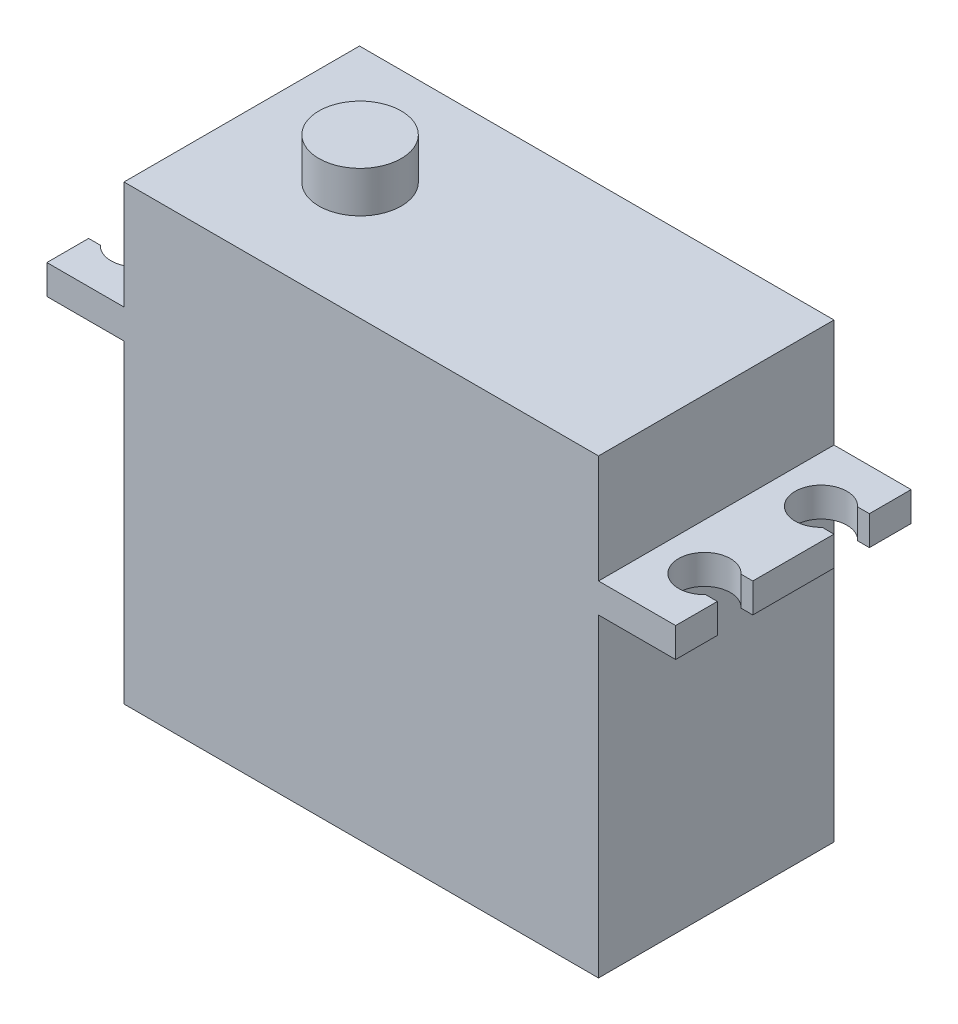
ISO-10303-21;
HEADER;
FILE_DESCRIPTION(('STEP AP214'),'2;1');
FILE_NAME('part.step','',(''),(''),'','','');
FILE_SCHEMA(('AUTOMOTIVE_DESIGN { 1 0 10303 214 1 1 1 1 }'));
ENDSEC;
DATA;
#1=APPLICATION_CONTEXT('core data for automotive mechanical design processes');
#2=APPLICATION_PROTOCOL_DEFINITION('international standard','automotive_design',2000,#1);
#3=PRODUCT_CONTEXT('',#1,'mechanical');
#4=PRODUCT('Part','Part','',(#3));
#5=PRODUCT_RELATED_PRODUCT_CATEGORY('part','',(#4));
#6=PRODUCT_DEFINITION_FORMATION('','',#4);
#7=PRODUCT_DEFINITION_CONTEXT('part definition',#1,'design');
#8=PRODUCT_DEFINITION('design','',#6,#7);
#9=PRODUCT_DEFINITION_SHAPE('','',#8);
#10=(LENGTH_UNIT() NAMED_UNIT(*) SI_UNIT(.MILLI.,.METRE.));
#11=(NAMED_UNIT(*) PLANE_ANGLE_UNIT() SI_UNIT($,.RADIAN.));
#12=(NAMED_UNIT(*) SI_UNIT($,.STERADIAN.) SOLID_ANGLE_UNIT());
#13=UNCERTAINTY_MEASURE_WITH_UNIT(LENGTH_MEASURE(1.E-05),#10,'distance_accuracy_value','');
#14=(GEOMETRIC_REPRESENTATION_CONTEXT(3) GLOBAL_UNCERTAINTY_ASSIGNED_CONTEXT((#13)) GLOBAL_UNIT_ASSIGNED_CONTEXT((#10,
#11,#12)) REPRESENTATION_CONTEXT('',''));
#15=CARTESIAN_POINT('',(0.,0.,0.));
#16=DIRECTION('',(0.,0.,1.));
#17=DIRECTION('',(1.,0.,0.));
#18=AXIS2_PLACEMENT_3D('',#15,#16,#17);
#19=CARTESIAN_POINT('',(20.15,38.4,-10.));
#20=DIRECTION('',(-1.,0.,0.));
#21=DIRECTION('',(0.,0.,1.));
#22=AXIS2_PLACEMENT_3D('',#19,#20,#21);
#23=PLANE('',#22);
#24=DIRECTION('',(0.,0.,1.));
#25=VECTOR('',#24,1.);
#26=CARTESIAN_POINT('',(20.15,29.2,-10.));
#27=LINE('',#26,#25);
#28=CARTESIAN_POINT('',(20.150000000001,29.2,-9.99999999999091));
#29=VERTEX_POINT('',#28);
#30=CARTESIAN_POINT('',(20.150000000001,29.2,9.99999999999091));
#31=VERTEX_POINT('',#30);
#32=EDGE_CURVE('E468',#29,#31,#27,.T.);
#33=ORIENTED_EDGE('',*,*,#32,.F.);
#34=DIRECTION('',(0.,-1.,0.));
#35=VECTOR('',#34,1.);
#36=CARTESIAN_POINT('',(20.15,38.4,-10.));
#37=LINE('',#36,#35);
#38=CARTESIAN_POINT('',(20.15,38.4,-10.));
#39=VERTEX_POINT('',#38);
#40=EDGE_CURVE('E11',#39,#29,#37,.T.);
#41=ORIENTED_EDGE('',*,*,#40,.F.);
#42=DIRECTION('',(0.,0.,-1.));
#43=VECTOR('',#42,1.);
#44=CARTESIAN_POINT('',(20.15,38.4,-10.));
#45=LINE('',#44,#43);
#46=CARTESIAN_POINT('',(20.15,38.4,10.));
#47=VERTEX_POINT('',#46);
#48=EDGE_CURVE('E472',#47,#39,#45,.T.);
#49=ORIENTED_EDGE('',*,*,#48,.F.);
#50=DIRECTION('',(0.,-1.,0.));
#51=VECTOR('',#50,1.);
#52=CARTESIAN_POINT('',(20.15,38.4,10.));
#53=LINE('',#52,#51);
#54=EDGE_CURVE('E501',#47,#31,#53,.T.);
#55=ORIENTED_EDGE('',*,*,#54,.T.);
#56=EDGE_LOOP('',(#33,#41,#49,#55));
#57=FACE_BOUND('',#56,.T.);
#58=ADVANCED_FACE('F41',(#57),#23,.F.);
#59=CARTESIAN_POINT('',(-20.15,38.4,-10.));
#60=DIRECTION('',(1.,0.,0.));
#61=DIRECTION('',(0.,0.,-1.));
#62=AXIS2_PLACEMENT_3D('',#59,#60,#61);
#63=PLANE('',#62);
#64=DIRECTION('',(0.,0.,-1.));
#65=VECTOR('',#64,1.);
#66=CARTESIAN_POINT('',(-20.15,29.2,-10.));
#67=LINE('',#66,#65);
#68=CARTESIAN_POINT('',(-20.150000000001,29.2,9.99999999999091));
#69=VERTEX_POINT('',#68);
#70=CARTESIAN_POINT('',(-20.150000000001,29.2,-9.99999999999091));
#71=VERTEX_POINT('',#70);
#72=EDGE_CURVE('E465',#69,#71,#67,.T.);
#73=ORIENTED_EDGE('',*,*,#72,.F.);
#74=DIRECTION('',(0.,-1.,0.));
#75=VECTOR('',#74,1.);
#76=CARTESIAN_POINT('',(-20.15,38.4,10.));
#77=LINE('',#76,#75);
#78=CARTESIAN_POINT('',(-20.15,38.4,10.));
#79=VERTEX_POINT('',#78);
#80=EDGE_CURVE('E506',#79,#69,#77,.T.);
#81=ORIENTED_EDGE('',*,*,#80,.F.);
#82=DIRECTION('',(0.,0.,1.));
#83=VECTOR('',#82,1.);
#84=CARTESIAN_POINT('',(-20.15,38.4,-10.));
#85=LINE('',#84,#83);
#86=CARTESIAN_POINT('',(-20.15,38.4,-10.));
#87=VERTEX_POINT('',#86);
#88=EDGE_CURVE('E480',#87,#79,#85,.T.);
#89=ORIENTED_EDGE('',*,*,#88,.F.);
#90=DIRECTION('',(0.,-1.,0.));
#91=VECTOR('',#90,1.);
#92=CARTESIAN_POINT('',(-20.15,38.4,-10.));
#93=LINE('',#92,#91);
#94=EDGE_CURVE('E510',#87,#71,#93,.T.);
#95=ORIENTED_EDGE('',*,*,#94,.T.);
#96=EDGE_LOOP('',(#73,#81,#89,#95));
#97=FACE_BOUND('',#96,.T.);
#98=ADVANCED_FACE('F570',(#97),#63,.F.);
#99=CARTESIAN_POINT('',(20.150000000001,26.7,-9.99999999999091));
#100=VERTEX_POINT('',#99);
#101=CARTESIAN_POINT('',(20.15,0.,-10.));
#102=VERTEX_POINT('',#101);
#103=EDGE_CURVE('E50',#100,#102,#37,.T.);
#104=ORIENTED_EDGE('',*,*,#103,.F.);
#105=DIRECTION('',(0.,0.,1.));
#106=VECTOR('',#105,1.);
#107=CARTESIAN_POINT('',(20.15,26.7,-10.));
#108=LINE('',#107,#106);
#109=CARTESIAN_POINT('',(20.15,26.7,10.));
#110=VERTEX_POINT('',#109);
#111=EDGE_CURVE('E462',#100,#110,#108,.T.);
#112=ORIENTED_EDGE('',*,*,#111,.T.);
#113=CARTESIAN_POINT('',(20.15,0.,10.));
#114=VERTEX_POINT('',#113);
#115=EDGE_CURVE('E486',#110,#114,#53,.T.);
#116=ORIENTED_EDGE('',*,*,#115,.T.);
#117=DIRECTION('',(0.,0.,-1.));
#118=VECTOR('',#117,1.);
#119=CARTESIAN_POINT('',(20.15,0.,-10.));
#120=LINE('',#119,#118);
#121=EDGE_CURVE('E471',#114,#102,#120,.T.);
#122=ORIENTED_EDGE('',*,*,#121,.T.);
#123=EDGE_LOOP('',(#104,#112,#116,#122));
#124=FACE_BOUND('',#123,.T.);
#125=ADVANCED_FACE('F43',(#124),#23,.F.);
#126=CARTESIAN_POINT('',(-20.15,38.4,-10.));
#127=DIRECTION('',(0.,0.,1.));
#128=DIRECTION('',(1.,0.,0.));
#129=AXIS2_PLACEMENT_3D('',#126,#127,#128);
#130=PLANE('',#129);
#131=CARTESIAN_POINT('',(-20.15,26.7,-10.));
#132=VERTEX_POINT('',#131);
#133=CARTESIAN_POINT('',(-20.15,0.,-10.));
#134=VERTEX_POINT('',#133);
#135=EDGE_CURVE('E509',#132,#134,#93,.T.);
#136=ORIENTED_EDGE('',*,*,#135,.F.);
#137=DIRECTION('',(1.,0.,0.));
#138=VECTOR('',#137,1.);
#139=CARTESIAN_POINT('',(400000.,26.7,-9.99999999999091));
#140=LINE('',#139,#138);
#141=CARTESIAN_POINT('',(-26.7000000000053,26.7,-9.99999999999091));
#142=VERTEX_POINT('',#141);
#143=EDGE_CURVE('E57',#142,#132,#140,.T.);
#144=ORIENTED_EDGE('',*,*,#143,.F.);
#145=DIRECTION('',(0.,-1.,0.));
#146=VECTOR('',#145,1.);
#147=CARTESIAN_POINT('',(-26.7000000000053,29.2,-9.99999999999091));
#148=LINE('',#147,#146);
#149=CARTESIAN_POINT('',(-26.7000000000053,29.2,-9.99999999999091));
#150=VERTEX_POINT('',#149);
#151=EDGE_CURVE('E420',#150,#142,#148,.T.);
#152=ORIENTED_EDGE('',*,*,#151,.F.);
#153=DIRECTION('',(1.,0.,0.));
#154=VECTOR('',#153,1.);
#155=CARTESIAN_POINT('',(400000.,29.2,-9.99999999999091));
#156=LINE('',#155,#154);
#157=EDGE_CURVE('E304',#150,#71,#156,.T.);
#158=ORIENTED_EDGE('',*,*,#157,.T.);
#159=ORIENTED_EDGE('',*,*,#94,.F.);
#160=DIRECTION('',(-1.,0.,0.));
#161=VECTOR('',#160,1.);
#162=CARTESIAN_POINT('',(-20.15,38.4,-10.));
#163=LINE('',#162,#161);
#164=EDGE_CURVE('E476',#39,#87,#163,.T.);
#165=ORIENTED_EDGE('',*,*,#164,.F.);
#166=ORIENTED_EDGE('',*,*,#40,.T.);
#167=CARTESIAN_POINT('',(26.7000000000041,29.2,-9.99999999999091));
#168=VERTEX_POINT('',#167);
#169=EDGE_CURVE('E303',#29,#168,#156,.T.);
#170=ORIENTED_EDGE('',*,*,#169,.T.);
#171=DIRECTION('',(0.,-1.,0.));
#172=VECTOR('',#171,1.);
#173=CARTESIAN_POINT('',(26.7000000000041,29.2,-9.99999999999091));
#174=LINE('',#173,#172);
#175=CARTESIAN_POINT('',(26.7000000000041,26.7,-9.99999999999091));
#176=VERTEX_POINT('',#175);
#177=EDGE_CURVE('E423',#168,#176,#174,.T.);
#178=ORIENTED_EDGE('',*,*,#177,.T.);
#179=EDGE_CURVE('E378',#100,#176,#140,.T.);
#180=ORIENTED_EDGE('',*,*,#179,.F.);
#181=ORIENTED_EDGE('',*,*,#103,.T.);
#182=DIRECTION('',(-1.,0.,0.));
#183=VECTOR('',#182,1.);
#184=CARTESIAN_POINT('',(-20.15,0.,-10.));
#185=LINE('',#184,#183);
#186=EDGE_CURVE('E490',#102,#134,#185,.T.);
#187=ORIENTED_EDGE('',*,*,#186,.T.);
#188=EDGE_LOOP('',(#136,#144,#152,#158,#159,#165,#166,#170,#178,#180,#181,#187));
#189=FACE_BOUND('',#188,.T.);
#190=ADVANCED_FACE('F527',(#189),#130,.F.);
#191=CARTESIAN_POINT('',(-20.150000000001,26.7,9.99999999999091));
#192=VERTEX_POINT('',#191);
#193=CARTESIAN_POINT('',(-20.15,0.,10.));
#194=VERTEX_POINT('',#193);
#195=EDGE_CURVE('E505',#192,#194,#77,.T.);
#196=ORIENTED_EDGE('',*,*,#195,.F.);
#197=DIRECTION('',(0.,0.,-1.));
#198=VECTOR('',#197,1.);
#199=CARTESIAN_POINT('',(-20.15,26.7,-10.));
#200=LINE('',#199,#198);
#201=EDGE_CURVE('E253',#192,#132,#200,.T.);
#202=ORIENTED_EDGE('',*,*,#201,.T.);
#203=ORIENTED_EDGE('',*,*,#135,.T.);
#204=DIRECTION('',(0.,0.,1.));
#205=VECTOR('',#204,1.);
#206=CARTESIAN_POINT('',(-20.15,0.,-10.));
#207=LINE('',#206,#205);
#208=EDGE_CURVE('E494',#134,#194,#207,.T.);
#209=ORIENTED_EDGE('',*,*,#208,.T.);
#210=EDGE_LOOP('',(#196,#202,#203,#209));
#211=FACE_BOUND('',#210,.T.);
#212=ADVANCED_FACE('F522',(#211),#63,.F.);
#213=CARTESIAN_POINT('',(-20.15,38.4,10.));
#214=DIRECTION('',(0.,0.,-1.));
#215=DIRECTION('',(-1.,0.,0.));
#216=AXIS2_PLACEMENT_3D('',#213,#214,#215);
#217=PLANE('',#216);
#218=ORIENTED_EDGE('',*,*,#115,.F.);
#219=DIRECTION('',(-1.,0.,0.));
#220=VECTOR('',#219,1.);
#221=CARTESIAN_POINT('',(400000.,26.7,9.99999999999091));
#222=LINE('',#221,#220);
#223=CARTESIAN_POINT('',(26.7000000000053,26.7,9.99999999999091));
#224=VERTEX_POINT('',#223);
#225=EDGE_CURVE('E65',#224,#110,#222,.T.);
#226=ORIENTED_EDGE('',*,*,#225,.F.);
#227=DIRECTION('',(0.,-1.,0.));
#228=VECTOR('',#227,1.);
#229=CARTESIAN_POINT('',(26.7000000000053,29.2,9.99999999999091));
#230=LINE('',#229,#228);
#231=CARTESIAN_POINT('',(26.7000000000053,29.2,9.99999999999091));
#232=VERTEX_POINT('',#231);
#233=EDGE_CURVE('E451',#232,#224,#230,.T.);
#234=ORIENTED_EDGE('',*,*,#233,.F.);
#235=DIRECTION('',(-1.,0.,0.));
#236=VECTOR('',#235,1.);
#237=CARTESIAN_POINT('',(400000.,29.2,9.99999999999091));
#238=LINE('',#237,#236);
#239=EDGE_CURVE('E265',#232,#31,#238,.T.);
#240=ORIENTED_EDGE('',*,*,#239,.T.);
#241=ORIENTED_EDGE('',*,*,#54,.F.);
#242=DIRECTION('',(1.,0.,0.));
#243=VECTOR('',#242,1.);
#244=CARTESIAN_POINT('',(-20.15,38.4,10.));
#245=LINE('',#244,#243);
#246=EDGE_CURVE('E483',#79,#47,#245,.T.);
#247=ORIENTED_EDGE('',*,*,#246,.F.);
#248=ORIENTED_EDGE('',*,*,#80,.T.);
#249=CARTESIAN_POINT('',(-26.7000000000053,29.2,9.99999999999091));
#250=VERTEX_POINT('',#249);
#251=EDGE_CURVE('E261',#69,#250,#238,.T.);
#252=ORIENTED_EDGE('',*,*,#251,.T.);
#253=DIRECTION('',(0.,-1.,0.));
#254=VECTOR('',#253,1.);
#255=CARTESIAN_POINT('',(-26.7000000000053,29.2,9.99999999999091));
#256=LINE('',#255,#254);
#257=CARTESIAN_POINT('',(-26.7000000000053,26.7,9.99999999999091));
#258=VERTEX_POINT('',#257);
#259=EDGE_CURVE('E454',#250,#258,#256,.T.);
#260=ORIENTED_EDGE('',*,*,#259,.T.);
#261=EDGE_CURVE('E340',#192,#258,#222,.T.);
#262=ORIENTED_EDGE('',*,*,#261,.F.);
#263=ORIENTED_EDGE('',*,*,#195,.T.);
#264=DIRECTION('',(1.,0.,0.));
#265=VECTOR('',#264,1.);
#266=CARTESIAN_POINT('',(-20.15,0.,10.));
#267=LINE('',#266,#265);
#268=EDGE_CURVE('E477',#194,#114,#267,.T.);
#269=ORIENTED_EDGE('',*,*,#268,.T.);
#270=EDGE_LOOP('',(#218,#226,#234,#240,#241,#247,#248,#252,#260,#262,#263,#269));
#271=FACE_BOUND('',#270,.T.);
#272=ADVANCED_FACE('F535',(#271),#217,.F.);
#273=CARTESIAN_POINT('',(0.,38.4,0.));
#274=DIRECTION('',(0.,1.,0.));
#275=DIRECTION('',(0.,0.,1.));
#276=AXIS2_PLACEMENT_3D('',#273,#274,#275);
#277=PLANE('',#276);
#278=CARTESIAN_POINT('',(-10.1000000000053,38.4,0.));
#279=DIRECTION('',(0.,1.,0.));
#280=DIRECTION('',(0.,0.,1.));
#281=AXIS2_PLACEMENT_3D('',#278,#279,#280);
#282=CIRCLE('',#281,3.5);
#283=CARTESIAN_POINT('',(-10.1000000000053,38.4,3.5));
#284=VERTEX_POINT('',#283);
#285=EDGE_CURVE('E552',#284,#284,#282,.T.);
#286=ORIENTED_EDGE('',*,*,#285,.F.);
#287=EDGE_LOOP('',(#286));
#288=FACE_BOUND('',#287,.T.);
#289=ORIENTED_EDGE('',*,*,#48,.T.);
#290=ORIENTED_EDGE('',*,*,#164,.T.);
#291=ORIENTED_EDGE('',*,*,#88,.T.);
#292=ORIENTED_EDGE('',*,*,#246,.T.);
#293=EDGE_LOOP('',(#289,#290,#291,#292));
#294=FACE_BOUND('',#293,.T.);
#295=ADVANCED_FACE('F559',(#288,#294),#277,.T.);
#296=CARTESIAN_POINT('',(0.,0.,0.));
#297=DIRECTION('',(0.,1.,0.));
#298=DIRECTION('',(0.,0.,1.));
#299=AXIS2_PLACEMENT_3D('',#296,#297,#298);
#300=PLANE('',#299);
#301=ORIENTED_EDGE('',*,*,#121,.F.);
#302=ORIENTED_EDGE('',*,*,#268,.F.);
#303=ORIENTED_EDGE('',*,*,#208,.F.);
#304=ORIENTED_EDGE('',*,*,#186,.F.);
#305=EDGE_LOOP('',(#301,#302,#303,#304));
#306=FACE_BOUND('',#305,.T.);
#307=ADVANCED_FACE('F532',(#306),#300,.F.);
#308=CARTESIAN_POINT('',(-26.7000000002895,29.2,291589.));
#309=DIRECTION('',(-1.,0.,0.));
#310=DIRECTION('',(0.,0.,1.));
#311=AXIS2_PLACEMENT_3D('',#308,#309,#310);
#312=PLANE('',#311);
#313=DIRECTION('',(0.,0.,-1.));
#314=VECTOR('',#313,1.);
#315=CARTESIAN_POINT('',(-26.7000000002895,26.7,291589.));
#316=LINE('',#315,#314);
#317=CARTESIAN_POINT('',(-26.7000000000041,26.7,-6.45517227451364));
#318=VERTEX_POINT('',#317);
#319=EDGE_CURVE('E381',#318,#142,#316,.T.);
#320=ORIENTED_EDGE('',*,*,#319,.F.);
#321=DIRECTION('',(0.,-1.,0.));
#322=VECTOR('',#321,1.);
#323=CARTESIAN_POINT('',(-26.7000000000041,29.2,-6.45517227451364));
#324=LINE('',#323,#322);
#325=CARTESIAN_POINT('',(-26.7000000000041,29.2,-6.45517227451364));
#326=VERTEX_POINT('',#325);
#327=EDGE_CURVE('E417',#326,#318,#324,.T.);
#328=ORIENTED_EDGE('',*,*,#327,.F.);
#329=DIRECTION('',(0.,0.,-1.));
#330=VECTOR('',#329,1.);
#331=CARTESIAN_POINT('',(-26.7000000002895,29.2,291589.));
#332=LINE('',#331,#330);
#333=EDGE_CURVE('E308',#326,#150,#332,.T.);
#334=ORIENTED_EDGE('',*,*,#333,.T.);
#335=ORIENTED_EDGE('',*,*,#151,.T.);
#336=EDGE_LOOP('',(#320,#328,#334,#335));
#337=FACE_BOUND('',#336,.T.);
#338=ADVANCED_FACE('F640',(#337),#312,.T.);
#339=CARTESIAN_POINT('',(400000.,29.2,-6.45517227451364));
#340=DIRECTION('',(0.,0.,1.));
#341=DIRECTION('',(1.,0.,0.));
#342=AXIS2_PLACEMENT_3D('',#339,#340,#341);
#343=PLANE('',#342);
#344=DIRECTION('',(-1.,0.,0.));
#345=VECTOR('',#344,1.);
#346=CARTESIAN_POINT('',(400000.,26.7,-6.45517227451364));
#347=LINE('',#346,#345);
#348=CARTESIAN_POINT('',(-25.704511272636,26.7,-6.45517227451364));
#349=VERTEX_POINT('',#348);
#350=EDGE_CURVE('E384',#349,#318,#347,.T.);
#351=ORIENTED_EDGE('',*,*,#350,.F.);
#352=DIRECTION('',(0.,-1.,0.));
#353=VECTOR('',#352,1.);
#354=CARTESIAN_POINT('',(-25.704511272636,29.2,-6.45517227451364));
#355=LINE('',#354,#353);
#356=CARTESIAN_POINT('',(-25.704511272636,29.2,-6.45517227451364));
#357=VERTEX_POINT('',#356);
#358=EDGE_CURVE('E414',#357,#349,#355,.T.);
#359=ORIENTED_EDGE('',*,*,#358,.F.);
#360=DIRECTION('',(-1.,0.,0.));
#361=VECTOR('',#360,1.);
#362=CARTESIAN_POINT('',(400000.,29.2,-6.45517227451364));
#363=LINE('',#362,#361);
#364=EDGE_CURVE('E312',#357,#326,#363,.T.);
#365=ORIENTED_EDGE('',*,*,#364,.T.);
#366=ORIENTED_EDGE('',*,*,#327,.T.);
#367=EDGE_LOOP('',(#351,#359,#365,#366));
#368=FACE_BOUND('',#367,.T.);
#369=ADVANCED_FACE('F668',(#368),#343,.T.);
#370=CARTESIAN_POINT('',(-24.1,29.2,-4.95));
#371=DIRECTION('',(0.,-1.,0.));
#372=DIRECTION('',(0.,0.,-1.));
#373=AXIS2_PLACEMENT_3D('',#370,#371,#372);
#374=CYLINDRICAL_SURFACE('',#373,2.2);
#375=CARTESIAN_POINT('',(-24.1,26.7,-4.95));
#376=DIRECTION('',(0.,-1.,0.));
#377=DIRECTION('',(0.,0.,-1.));
#378=AXIS2_PLACEMENT_3D('',#375,#376,#377);
#379=CIRCLE('',#378,2.2);
#380=CARTESIAN_POINT('',(-25.7045112726491,26.7,-3.44482772549382));
#381=VERTEX_POINT('',#380);
#382=EDGE_CURVE('E388',#349,#381,#379,.T.);
#383=ORIENTED_EDGE('',*,*,#382,.T.);
#384=DIRECTION('',(0.,-1.,0.));
#385=VECTOR('',#384,1.);
#386=CARTESIAN_POINT('',(-25.7045112726491,29.2,-3.44482772549382));
#387=LINE('',#386,#385);
#388=CARTESIAN_POINT('',(-25.7045112726491,29.2,-3.44482772549382));
#389=VERTEX_POINT('',#388);
#390=EDGE_CURVE('E411',#389,#381,#387,.T.);
#391=ORIENTED_EDGE('',*,*,#390,.F.);
#392=CARTESIAN_POINT('',(-24.1,29.2,-4.95));
#393=DIRECTION('',(0.,-1.,0.));
#394=DIRECTION('',(0.,0.,-1.));
#395=AXIS2_PLACEMENT_3D('',#392,#393,#394);
#396=CIRCLE('',#395,2.2);
#397=EDGE_CURVE('E316',#357,#389,#396,.T.);
#398=ORIENTED_EDGE('',*,*,#397,.F.);
#399=ORIENTED_EDGE('',*,*,#358,.T.);
#400=EDGE_LOOP('',(#383,#391,#398,#399));
#401=FACE_BOUND('',#400,.T.);
#402=ADVANCED_FACE('F672',(#401),#374,.F.);
#403=CARTESIAN_POINT('',(400000.,29.2,-3.44482772533183));
#404=DIRECTION('',(0.,0.,-1.));
#405=DIRECTION('',(-1.,0.,0.));
#406=AXIS2_PLACEMENT_3D('',#403,#404,#405);
#407=PLANE('',#406);
#408=DIRECTION('',(1.,0.,0.));
#409=VECTOR('',#408,1.);
#410=CARTESIAN_POINT('',(400000.,26.7,-3.44482772533183));
#411=LINE('',#410,#409);
#412=CARTESIAN_POINT('',(-26.7000000000053,26.7,-3.4448277255061));
#413=VERTEX_POINT('',#412);
#414=EDGE_CURVE('E392',#413,#381,#411,.T.);
#415=ORIENTED_EDGE('',*,*,#414,.F.);
#416=DIRECTION('',(0.,-1.,0.));
#417=VECTOR('',#416,1.);
#418=CARTESIAN_POINT('',(-26.7000000000053,29.2,-3.4448277255061));
#419=LINE('',#418,#417);
#420=CARTESIAN_POINT('',(-26.7000000000053,29.2,-3.4448277255061));
#421=VERTEX_POINT('',#420);
#422=EDGE_CURVE('E408',#421,#413,#419,.T.);
#423=ORIENTED_EDGE('',*,*,#422,.F.);
#424=DIRECTION('',(1.,0.,0.));
#425=VECTOR('',#424,1.);
#426=CARTESIAN_POINT('',(400000.,29.2,-3.44482772533183));
#427=LINE('',#426,#425);
#428=EDGE_CURVE('E319',#421,#389,#427,.T.);
#429=ORIENTED_EDGE('',*,*,#428,.T.);
#430=ORIENTED_EDGE('',*,*,#390,.T.);
#431=EDGE_LOOP('',(#415,#423,#429,#430));
#432=FACE_BOUND('',#431,.T.);
#433=ADVANCED_FACE('F676',(#432),#407,.T.);
#434=CARTESIAN_POINT('',(-26.7000000000053,29.2,291589.));
#435=DIRECTION('',(-1.,0.,0.));
#436=DIRECTION('',(0.,0.,1.));
#437=AXIS2_PLACEMENT_3D('',#434,#435,#436);
#438=PLANE('',#437);
#439=DIRECTION('',(0.,0.,-1.));
#440=VECTOR('',#439,1.);
#441=CARTESIAN_POINT('',(-26.7000000000053,26.7,291589.));
#442=LINE('',#441,#440);
#443=CARTESIAN_POINT('',(-26.7000000000053,26.7,3.44482772550236));
#444=VERTEX_POINT('',#443);
#445=EDGE_CURVE('E396',#444,#413,#442,.T.);
#446=ORIENTED_EDGE('',*,*,#445,.F.);
#447=DIRECTION('',(0.,-1.,0.));
#448=VECTOR('',#447,1.);
#449=CARTESIAN_POINT('',(-26.7000000000053,29.2,3.44482772550236));
#450=LINE('',#449,#448);
#451=CARTESIAN_POINT('',(-26.7000000000053,29.2,3.44482772550236));
#452=VERTEX_POINT('',#451);
#453=EDGE_CURVE('E405',#452,#444,#450,.T.);
#454=ORIENTED_EDGE('',*,*,#453,.F.);
#455=DIRECTION('',(0.,0.,-1.));
#456=VECTOR('',#455,1.);
#457=CARTESIAN_POINT('',(-26.7000000000053,29.2,291589.));
#458=LINE('',#457,#456);
#459=EDGE_CURVE('E323',#452,#421,#458,.T.);
#460=ORIENTED_EDGE('',*,*,#459,.T.);
#461=ORIENTED_EDGE('',*,*,#422,.T.);
#462=EDGE_LOOP('',(#446,#454,#460,#461));
#463=FACE_BOUND('',#462,.T.);
#464=ADVANCED_FACE('F680',(#463),#438,.T.);
#465=CARTESIAN_POINT('',(400000.,29.2,3.44482772567289));
#466=DIRECTION('',(0.,0.,1.));
#467=DIRECTION('',(1.,0.,0.));
#468=AXIS2_PLACEMENT_3D('',#465,#466,#467);
#469=PLANE('',#468);
#470=DIRECTION('',(-1.,0.,0.));
#471=VECTOR('',#470,1.);
#472=CARTESIAN_POINT('',(400000.,26.7,3.44482772567289));
#473=LINE('',#472,#471);
#474=CARTESIAN_POINT('',(-25.704511272636,26.7,3.44482772549862));
#475=VERTEX_POINT('',#474);
#476=EDGE_CURVE('E242',#475,#444,#473,.T.);
#477=ORIENTED_EDGE('',*,*,#476,.F.);
#478=DIRECTION('',(0.,-1.,0.));
#479=VECTOR('',#478,1.);
#480=CARTESIAN_POINT('',(-25.704511272636,29.2,3.44482772549862));
#481=LINE('',#480,#479);
#482=CARTESIAN_POINT('',(-25.704511272636,29.2,3.44482772549862));
#483=VERTEX_POINT('',#482);
#484=EDGE_CURVE('E329',#483,#475,#481,.T.);
#485=ORIENTED_EDGE('',*,*,#484,.F.);
#486=DIRECTION('',(-1.,0.,0.));
#487=VECTOR('',#486,1.);
#488=CARTESIAN_POINT('',(400000.,29.2,3.44482772567289));
#489=LINE('',#488,#487);
#490=EDGE_CURVE('E239',#483,#452,#489,.T.);
#491=ORIENTED_EDGE('',*,*,#490,.T.);
#492=ORIENTED_EDGE('',*,*,#453,.T.);
#493=EDGE_LOOP('',(#477,#485,#491,#492));
#494=FACE_BOUND('',#493,.T.);
#495=ADVANCED_FACE('F644',(#494),#469,.T.);
#496=CARTESIAN_POINT('',(-24.1,29.2,4.95));
#497=DIRECTION('',(0.,-1.,0.));
#498=DIRECTION('',(0.,0.,-1.));
#499=AXIS2_PLACEMENT_3D('',#496,#497,#498);
#500=CYLINDRICAL_SURFACE('',#499,2.2);
#501=CARTESIAN_POINT('',(-24.1,26.7,4.95));
#502=DIRECTION('',(0.,-1.,0.));
#503=DIRECTION('',(0.,0.,-1.));
#504=AXIS2_PLACEMENT_3D('',#501,#502,#503);
#505=CIRCLE('',#504,2.2);
#506=CARTESIAN_POINT('',(-25.704511272636,26.7,6.45517227451364));
#507=VERTEX_POINT('',#506);
#508=EDGE_CURVE('E248',#475,#507,#505,.T.);
#509=ORIENTED_EDGE('',*,*,#508,.T.);
#510=DIRECTION('',(0.,-1.,0.));
#511=VECTOR('',#510,1.);
#512=CARTESIAN_POINT('',(-25.704511272636,29.2,6.45517227451364));
#513=LINE('',#512,#511);
#514=CARTESIAN_POINT('',(-25.704511272636,29.2,6.45517227451364));
#515=VERTEX_POINT('',#514);
#516=EDGE_CURVE('E245',#515,#507,#513,.T.);
#517=ORIENTED_EDGE('',*,*,#516,.F.);
#518=CARTESIAN_POINT('',(-24.1,29.2,4.95));
#519=DIRECTION('',(0.,-1.,0.));
#520=DIRECTION('',(0.,0.,-1.));
#521=AXIS2_PLACEMENT_3D('',#518,#519,#520);
#522=CIRCLE('',#521,2.2);
#523=EDGE_CURVE('E230',#483,#515,#522,.T.);
#524=ORIENTED_EDGE('',*,*,#523,.F.);
#525=ORIENTED_EDGE('',*,*,#484,.T.);
#526=EDGE_LOOP('',(#509,#517,#524,#525));
#527=FACE_BOUND('',#526,.T.);
#528=ADVANCED_FACE('F246',(#527),#500,.F.);
#529=CARTESIAN_POINT('',(400000.,29.2,6.45517227451364));
#530=DIRECTION('',(0.,0.,-1.));
#531=DIRECTION('',(-1.,0.,0.));
#532=AXIS2_PLACEMENT_3D('',#529,#530,#531);
#533=PLANE('',#532);
#534=DIRECTION('',(1.,0.,0.));
#535=VECTOR('',#534,1.);
#536=CARTESIAN_POINT('',(400000.,26.7,6.45517227451364));
#537=LINE('',#536,#535);
#538=CARTESIAN_POINT('',(-26.7000000000053,26.7,6.45517227451364));
#539=VERTEX_POINT('',#538);
#540=EDGE_CURVE('E332',#539,#507,#537,.T.);
#541=ORIENTED_EDGE('',*,*,#540,.F.);
#542=DIRECTION('',(0.,-1.,0.));
#543=VECTOR('',#542,1.);
#544=CARTESIAN_POINT('',(-26.7000000000053,29.2,6.45517227451364));
#545=LINE('',#544,#543);
#546=CARTESIAN_POINT('',(-26.7000000000053,29.2,6.45517227451364));
#547=VERTEX_POINT('',#546);
#548=EDGE_CURVE('E254',#547,#539,#545,.T.);
#549=ORIENTED_EDGE('',*,*,#548,.F.);
#550=DIRECTION('',(1.,0.,0.));
#551=VECTOR('',#550,1.);
#552=CARTESIAN_POINT('',(400000.,29.2,6.45517227451364));
#553=LINE('',#552,#551);
#554=EDGE_CURVE('E235',#547,#515,#553,.T.);
#555=ORIENTED_EDGE('',*,*,#554,.T.);
#556=ORIENTED_EDGE('',*,*,#516,.T.);
#557=EDGE_LOOP('',(#541,#549,#555,#556));
#558=FACE_BOUND('',#557,.T.);
#559=ADVANCED_FACE('F256',(#558),#533,.T.);
#560=CARTESIAN_POINT('',(-26.7000000000053,29.2,291589.));
#561=DIRECTION('',(-1.,0.,0.));
#562=DIRECTION('',(0.,0.,1.));
#563=AXIS2_PLACEMENT_3D('',#560,#561,#562);
#564=PLANE('',#563);
#565=DIRECTION('',(0.,0.,-1.));
#566=VECTOR('',#565,1.);
#567=CARTESIAN_POINT('',(-26.7000000000053,26.7,291589.));
#568=LINE('',#567,#566);
#569=EDGE_CURVE('E336',#258,#539,#568,.T.);
#570=ORIENTED_EDGE('',*,*,#569,.F.);
#571=ORIENTED_EDGE('',*,*,#259,.F.);
#572=DIRECTION('',(0.,0.,-1.));
#573=VECTOR('',#572,1.);
#574=CARTESIAN_POINT('',(-26.7000000000053,29.2,291589.));
#575=LINE('',#574,#573);
#576=EDGE_CURVE('E258',#250,#547,#575,.T.);
#577=ORIENTED_EDGE('',*,*,#576,.T.);
#578=ORIENTED_EDGE('',*,*,#548,.T.);
#579=EDGE_LOOP('',(#570,#571,#577,#578));
#580=FACE_BOUND('',#579,.T.);
#581=ADVANCED_FACE('F546',(#580),#564,.T.);
#582=CARTESIAN_POINT('',(-24.1,29.2,4.95));
#583=DIRECTION('',(0.,-1.,0.));
#584=DIRECTION('',(0.,0.,-1.));
#585=AXIS2_PLACEMENT_3D('',#582,#583,#584);
#586=PLANE('',#585);
#587=ORIENTED_EDGE('',*,*,#251,.F.);
#588=ORIENTED_EDGE('',*,*,#72,.T.);
#589=ORIENTED_EDGE('',*,*,#157,.F.);
#590=ORIENTED_EDGE('',*,*,#333,.F.);
#591=ORIENTED_EDGE('',*,*,#364,.F.);
#592=ORIENTED_EDGE('',*,*,#397,.T.);
#593=ORIENTED_EDGE('',*,*,#428,.F.);
#594=ORIENTED_EDGE('',*,*,#459,.F.);
#595=ORIENTED_EDGE('',*,*,#490,.F.);
#596=ORIENTED_EDGE('',*,*,#523,.T.);
#597=ORIENTED_EDGE('',*,*,#554,.F.);
#598=ORIENTED_EDGE('',*,*,#576,.F.);
#599=EDGE_LOOP('',(#587,#588,#589,#590,#591,#592,#593,#594,#595,#596,#597,#598));
#600=FACE_BOUND('',#599,.T.);
#601=ADVANCED_FACE('F232',(#600),#586,.F.);
#602=CARTESIAN_POINT('',(-24.1,26.7,4.95));
#603=DIRECTION('',(0.,-1.,0.));
#604=DIRECTION('',(0.,0.,-1.));
#605=AXIS2_PLACEMENT_3D('',#602,#603,#604);
#606=PLANE('',#605);
#607=ORIENTED_EDGE('',*,*,#201,.F.);
#608=ORIENTED_EDGE('',*,*,#261,.T.);
#609=ORIENTED_EDGE('',*,*,#569,.T.);
#610=ORIENTED_EDGE('',*,*,#540,.T.);
#611=ORIENTED_EDGE('',*,*,#508,.F.);
#612=ORIENTED_EDGE('',*,*,#476,.T.);
#613=ORIENTED_EDGE('',*,*,#445,.T.);
#614=ORIENTED_EDGE('',*,*,#414,.T.);
#615=ORIENTED_EDGE('',*,*,#382,.F.);
#616=ORIENTED_EDGE('',*,*,#350,.T.);
#617=ORIENTED_EDGE('',*,*,#319,.T.);
#618=ORIENTED_EDGE('',*,*,#143,.T.);
#619=EDGE_LOOP('',(#607,#608,#609,#610,#611,#612,#613,#614,#615,#616,#617,#618));
#620=FACE_BOUND('',#619,.T.);
#621=ADVANCED_FACE('F547',(#620),#606,.T.);
#622=ORIENTED_EDGE('',*,*,#169,.F.);
#623=ORIENTED_EDGE('',*,*,#32,.T.);
#624=ORIENTED_EDGE('',*,*,#239,.F.);
#625=DIRECTION('',(0.,0.,1.));
#626=VECTOR('',#625,1.);
#627=CARTESIAN_POINT('',(26.6999999997211,29.2,291589.));
#628=LINE('',#627,#626);
#629=CARTESIAN_POINT('',(26.7000000000064,29.2,6.45517227451364));
#630=VERTEX_POINT('',#629);
#631=EDGE_CURVE('E269',#630,#232,#628,.T.);
#632=ORIENTED_EDGE('',*,*,#631,.F.);
#633=DIRECTION('',(1.,0.,0.));
#634=VECTOR('',#633,1.);
#635=CARTESIAN_POINT('',(400000.,29.2,6.45517227451364));
#636=LINE('',#635,#634);
#637=CARTESIAN_POINT('',(25.704511272636,29.2,6.45517227451364));
#638=VERTEX_POINT('',#637);
#639=EDGE_CURVE('E273',#638,#630,#636,.T.);
#640=ORIENTED_EDGE('',*,*,#639,.F.);
#641=CARTESIAN_POINT('',(24.1,29.2,4.95));
#642=DIRECTION('',(0.,-1.,0.));
#643=DIRECTION('',(0.,0.,-1.));
#644=AXIS2_PLACEMENT_3D('',#641,#642,#643);
#645=CIRCLE('',#644,2.2);
#646=CARTESIAN_POINT('',(25.7045112726472,29.2,3.44482772549183));
#647=VERTEX_POINT('',#646);
#648=EDGE_CURVE('E277',#638,#647,#645,.T.);
#649=ORIENTED_EDGE('',*,*,#648,.T.);
#650=DIRECTION('',(-1.,0.,0.));
#651=VECTOR('',#650,1.);
#652=CARTESIAN_POINT('',(400000.,29.2,3.44482772550236));
#653=LINE('',#652,#651);
#654=CARTESIAN_POINT('',(26.7000000000053,29.2,3.44482772550236));
#655=VERTEX_POINT('',#654);
#656=EDGE_CURVE('E280',#655,#647,#653,.T.);
#657=ORIENTED_EDGE('',*,*,#656,.F.);
#658=DIRECTION('',(0.,0.,1.));
#659=VECTOR('',#658,1.);
#660=CARTESIAN_POINT('',(26.7000000000053,29.2,291589.));
#661=LINE('',#660,#659);
#662=CARTESIAN_POINT('',(26.7000000000053,29.2,-3.44482772550236));
#663=VERTEX_POINT('',#662);
#664=EDGE_CURVE('E284',#663,#655,#661,.T.);
#665=ORIENTED_EDGE('',*,*,#664,.F.);
#666=DIRECTION('',(1.,0.,0.));
#667=VECTOR('',#666,1.);
#668=CARTESIAN_POINT('',(400000.,29.2,-3.44482772550236));
#669=LINE('',#668,#667);
#670=CARTESIAN_POINT('',(25.704511272636,29.2,-3.44482772550236));
#671=VERTEX_POINT('',#670);
#672=EDGE_CURVE('E288',#671,#663,#669,.T.);
#673=ORIENTED_EDGE('',*,*,#672,.F.);
#674=CARTESIAN_POINT('',(24.1,29.2,-4.95));
#675=DIRECTION('',(0.,-1.,0.));
#676=DIRECTION('',(0.,0.,-1.));
#677=AXIS2_PLACEMENT_3D('',#674,#675,#676);
#678=CIRCLE('',#677,2.2);
#679=CARTESIAN_POINT('',(25.7045112726392,29.2,-6.45517227451669));
#680=VERTEX_POINT('',#679);
#681=EDGE_CURVE('E292',#671,#680,#678,.T.);
#682=ORIENTED_EDGE('',*,*,#681,.T.);
#683=DIRECTION('',(-1.,0.,0.));
#684=VECTOR('',#683,1.);
#685=CARTESIAN_POINT('',(400000.,29.2,-6.45517227451364));
#686=LINE('',#685,#684);
#687=CARTESIAN_POINT('',(26.7000000000053,29.2,-6.45517227451364));
#688=VERTEX_POINT('',#687);
#689=EDGE_CURVE('E295',#688,#680,#686,.T.);
#690=ORIENTED_EDGE('',*,*,#689,.F.);
#691=DIRECTION('',(0.,0.,1.));
#692=VECTOR('',#691,1.);
#693=CARTESIAN_POINT('',(26.7000000002895,29.2,291589.));
#694=LINE('',#693,#692);
#695=EDGE_CURVE('E299',#168,#688,#694,.T.);
#696=ORIENTED_EDGE('',*,*,#695,.F.);
#697=EDGE_LOOP('',(#622,#623,#624,#632,#640,#649,#657,#665,#673,#682,#690,#696));
#698=FACE_BOUND('',#697,.T.);
#699=ADVANCED_FACE('F574',(#698),#586,.F.);
#700=ORIENTED_EDGE('',*,*,#111,.F.);
#701=ORIENTED_EDGE('',*,*,#179,.T.);
#702=DIRECTION('',(0.,0.,1.));
#703=VECTOR('',#702,1.);
#704=CARTESIAN_POINT('',(26.7000000002895,26.7,291589.));
#705=LINE('',#704,#703);
#706=CARTESIAN_POINT('',(26.7000000000053,26.7,-6.45517227451364));
#707=VERTEX_POINT('',#706);
#708=EDGE_CURVE('E374',#176,#707,#705,.T.);
#709=ORIENTED_EDGE('',*,*,#708,.T.);
#710=DIRECTION('',(-1.,0.,0.));
#711=VECTOR('',#710,1.);
#712=CARTESIAN_POINT('',(400000.,26.7,-6.45517227451364));
#713=LINE('',#712,#711);
#714=CARTESIAN_POINT('',(25.7045112726392,26.7,-6.45517227451669));
#715=VERTEX_POINT('',#714);
#716=EDGE_CURVE('E370',#707,#715,#713,.T.);
#717=ORIENTED_EDGE('',*,*,#716,.T.);
#718=CARTESIAN_POINT('',(24.1,26.7,-4.95));
#719=DIRECTION('',(0.,-1.,0.));
#720=DIRECTION('',(0.,0.,-1.));
#721=AXIS2_PLACEMENT_3D('',#718,#719,#720);
#722=CIRCLE('',#721,2.2);
#723=CARTESIAN_POINT('',(25.704511272636,26.7,-3.44482772550236));
#724=VERTEX_POINT('',#723);
#725=EDGE_CURVE('E366',#724,#715,#722,.T.);
#726=ORIENTED_EDGE('',*,*,#725,.F.);
#727=DIRECTION('',(1.,0.,0.));
#728=VECTOR('',#727,1.);
#729=CARTESIAN_POINT('',(400000.,26.7,-3.44482772550236));
#730=LINE('',#729,#728);
#731=CARTESIAN_POINT('',(26.7000000000053,26.7,-3.44482772550236));
#732=VERTEX_POINT('',#731);
#733=EDGE_CURVE('E362',#724,#732,#730,.T.);
#734=ORIENTED_EDGE('',*,*,#733,.T.);
#735=DIRECTION('',(0.,0.,1.));
#736=VECTOR('',#735,1.);
#737=CARTESIAN_POINT('',(26.7000000000053,26.7,291589.));
#738=LINE('',#737,#736);
#739=CARTESIAN_POINT('',(26.7000000000053,26.7,3.44482772550236));
#740=VERTEX_POINT('',#739);
#741=EDGE_CURVE('E358',#732,#740,#738,.T.);
#742=ORIENTED_EDGE('',*,*,#741,.T.);
#743=DIRECTION('',(-1.,0.,0.));
#744=VECTOR('',#743,1.);
#745=CARTESIAN_POINT('',(400000.,26.7,3.44482772550236));
#746=LINE('',#745,#744);
#747=CARTESIAN_POINT('',(25.7045112726472,26.7,3.44482772549183));
#748=VERTEX_POINT('',#747);
#749=EDGE_CURVE('E354',#740,#748,#746,.T.);
#750=ORIENTED_EDGE('',*,*,#749,.T.);
#751=CARTESIAN_POINT('',(24.1,26.7,4.95));
#752=DIRECTION('',(0.,-1.,0.));
#753=DIRECTION('',(0.,0.,-1.));
#754=AXIS2_PLACEMENT_3D('',#751,#752,#753);
#755=CIRCLE('',#754,2.2);
#756=CARTESIAN_POINT('',(25.704511272636,26.7,6.45517227451364));
#757=VERTEX_POINT('',#756);
#758=EDGE_CURVE('E350',#757,#748,#755,.T.);
#759=ORIENTED_EDGE('',*,*,#758,.F.);
#760=DIRECTION('',(1.,0.,0.));
#761=VECTOR('',#760,1.);
#762=CARTESIAN_POINT('',(400000.,26.7,6.45517227451364));
#763=LINE('',#762,#761);
#764=CARTESIAN_POINT('',(26.7000000000064,26.7,6.45517227451364));
#765=VERTEX_POINT('',#764);
#766=EDGE_CURVE('E346',#757,#765,#763,.T.);
#767=ORIENTED_EDGE('',*,*,#766,.T.);
#768=DIRECTION('',(0.,0.,1.));
#769=VECTOR('',#768,1.);
#770=CARTESIAN_POINT('',(26.6999999997211,26.7,291589.));
#771=LINE('',#770,#769);
#772=EDGE_CURVE('E343',#765,#224,#771,.T.);
#773=ORIENTED_EDGE('',*,*,#772,.T.);
#774=ORIENTED_EDGE('',*,*,#225,.T.);
#775=EDGE_LOOP('',(#700,#701,#709,#717,#726,#734,#742,#750,#759,#767,#773,#774));
#776=FACE_BOUND('',#775,.T.);
#777=ADVANCED_FACE('F613',(#776),#606,.T.);
#778=CARTESIAN_POINT('',(26.6999999997211,29.2,291589.));
#779=DIRECTION('',(1.,0.,0.));
#780=DIRECTION('',(0.,0.,-1.));
#781=AXIS2_PLACEMENT_3D('',#778,#779,#780);
#782=PLANE('',#781);
#783=ORIENTED_EDGE('',*,*,#772,.F.);
#784=DIRECTION('',(0.,-1.,0.));
#785=VECTOR('',#784,1.);
#786=CARTESIAN_POINT('',(26.7000000000064,29.2,6.45517227451364));
#787=LINE('',#786,#785);
#788=EDGE_CURVE('E448',#630,#765,#787,.T.);
#789=ORIENTED_EDGE('',*,*,#788,.F.);
#790=ORIENTED_EDGE('',*,*,#631,.T.);
#791=ORIENTED_EDGE('',*,*,#233,.T.);
#792=EDGE_LOOP('',(#783,#789,#790,#791));
#793=FACE_BOUND('',#792,.T.);
#794=ADVANCED_FACE('F578',(#793),#782,.T.);
#795=CARTESIAN_POINT('',(400000.,29.2,6.45517227451364));
#796=DIRECTION('',(0.,0.,-1.));
#797=DIRECTION('',(-1.,0.,0.));
#798=AXIS2_PLACEMENT_3D('',#795,#796,#797);
#799=PLANE('',#798);
#800=ORIENTED_EDGE('',*,*,#766,.F.);
#801=DIRECTION('',(0.,-1.,0.));
#802=VECTOR('',#801,1.);
#803=CARTESIAN_POINT('',(25.704511272636,29.2,6.45517227451364));
#804=LINE('',#803,#802);
#805=EDGE_CURVE('E445',#638,#757,#804,.T.);
#806=ORIENTED_EDGE('',*,*,#805,.F.);
#807=ORIENTED_EDGE('',*,*,#639,.T.);
#808=ORIENTED_EDGE('',*,*,#788,.T.);
#809=EDGE_LOOP('',(#800,#806,#807,#808));
#810=FACE_BOUND('',#809,.T.);
#811=ADVANCED_FACE('F581',(#810),#799,.T.);
#812=CARTESIAN_POINT('',(24.1,29.2,4.95));
#813=DIRECTION('',(0.,-1.,0.));
#814=DIRECTION('',(0.,0.,-1.));
#815=AXIS2_PLACEMENT_3D('',#812,#813,#814);
#816=CYLINDRICAL_SURFACE('',#815,2.2);
#817=ORIENTED_EDGE('',*,*,#758,.T.);
#818=DIRECTION('',(0.,-1.,0.));
#819=VECTOR('',#818,1.);
#820=CARTESIAN_POINT('',(25.7045112726472,29.2,3.44482772549183));
#821=LINE('',#820,#819);
#822=EDGE_CURVE('E442',#647,#748,#821,.T.);
#823=ORIENTED_EDGE('',*,*,#822,.F.);
#824=ORIENTED_EDGE('',*,*,#648,.F.);
#825=ORIENTED_EDGE('',*,*,#805,.T.);
#826=EDGE_LOOP('',(#817,#823,#824,#825));
#827=FACE_BOUND('',#826,.T.);
#828=ADVANCED_FACE('F587',(#827),#816,.F.);
#829=CARTESIAN_POINT('',(400000.,29.2,3.44482772550236));
#830=DIRECTION('',(0.,0.,1.));
#831=DIRECTION('',(1.,0.,0.));
#832=AXIS2_PLACEMENT_3D('',#829,#830,#831);
#833=PLANE('',#832);
#834=ORIENTED_EDGE('',*,*,#749,.F.);
#835=DIRECTION('',(0.,-1.,0.));
#836=VECTOR('',#835,1.);
#837=CARTESIAN_POINT('',(26.7000000000053,29.2,3.44482772550236));
#838=LINE('',#837,#836);
#839=EDGE_CURVE('E439',#655,#740,#838,.T.);
#840=ORIENTED_EDGE('',*,*,#839,.F.);
#841=ORIENTED_EDGE('',*,*,#656,.T.);
#842=ORIENTED_EDGE('',*,*,#822,.T.);
#843=EDGE_LOOP('',(#834,#840,#841,#842));
#844=FACE_BOUND('',#843,.T.);
#845=ADVANCED_FACE('F591',(#844),#833,.T.);
#846=CARTESIAN_POINT('',(26.7000000000053,29.2,291589.));
#847=DIRECTION('',(1.,0.,0.));
#848=DIRECTION('',(0.,0.,-1.));
#849=AXIS2_PLACEMENT_3D('',#846,#847,#848);
#850=PLANE('',#849);
#851=ORIENTED_EDGE('',*,*,#741,.F.);
#852=DIRECTION('',(0.,-1.,0.));
#853=VECTOR('',#852,1.);
#854=CARTESIAN_POINT('',(26.7000000000053,29.2,-3.44482772550236));
#855=LINE('',#854,#853);
#856=EDGE_CURVE('E436',#663,#732,#855,.T.);
#857=ORIENTED_EDGE('',*,*,#856,.F.);
#858=ORIENTED_EDGE('',*,*,#664,.T.);
#859=ORIENTED_EDGE('',*,*,#839,.T.);
#860=EDGE_LOOP('',(#851,#857,#858,#859));
#861=FACE_BOUND('',#860,.T.);
#862=ADVANCED_FACE('F594',(#861),#850,.T.);
#863=CARTESIAN_POINT('',(400000.,29.2,-3.44482772550236));
#864=DIRECTION('',(0.,0.,-1.));
#865=DIRECTION('',(-1.,0.,0.));
#866=AXIS2_PLACEMENT_3D('',#863,#864,#865);
#867=PLANE('',#866);
#868=ORIENTED_EDGE('',*,*,#733,.F.);
#869=DIRECTION('',(0.,-1.,0.));
#870=VECTOR('',#869,1.);
#871=CARTESIAN_POINT('',(25.704511272636,29.2,-3.44482772550236));
#872=LINE('',#871,#870);
#873=EDGE_CURVE('E433',#671,#724,#872,.T.);
#874=ORIENTED_EDGE('',*,*,#873,.F.);
#875=ORIENTED_EDGE('',*,*,#672,.T.);
#876=ORIENTED_EDGE('',*,*,#856,.T.);
#877=EDGE_LOOP('',(#868,#874,#875,#876));
#878=FACE_BOUND('',#877,.T.);
#879=ADVANCED_FACE('F598',(#878),#867,.T.);
#880=CARTESIAN_POINT('',(24.1,29.2,-4.95));
#881=DIRECTION('',(0.,-1.,0.));
#882=DIRECTION('',(0.,0.,-1.));
#883=AXIS2_PLACEMENT_3D('',#880,#881,#882);
#884=CYLINDRICAL_SURFACE('',#883,2.2);
#885=ORIENTED_EDGE('',*,*,#725,.T.);
#886=DIRECTION('',(0.,-1.,0.));
#887=VECTOR('',#886,1.);
#888=CARTESIAN_POINT('',(25.7045112726392,29.2,-6.45517227451669));
#889=LINE('',#888,#887);
#890=EDGE_CURVE('E430',#680,#715,#889,.T.);
#891=ORIENTED_EDGE('',*,*,#890,.F.);
#892=ORIENTED_EDGE('',*,*,#681,.F.);
#893=ORIENTED_EDGE('',*,*,#873,.T.);
#894=EDGE_LOOP('',(#885,#891,#892,#893));
#895=FACE_BOUND('',#894,.T.);
#896=ADVANCED_FACE('F603',(#895),#884,.F.);
#897=CARTESIAN_POINT('',(400000.,29.2,-6.45517227451364));
#898=DIRECTION('',(0.,0.,1.));
#899=DIRECTION('',(1.,0.,0.));
#900=AXIS2_PLACEMENT_3D('',#897,#898,#899);
#901=PLANE('',#900);
#902=ORIENTED_EDGE('',*,*,#716,.F.);
#903=DIRECTION('',(0.,-1.,0.));
#904=VECTOR('',#903,1.);
#905=CARTESIAN_POINT('',(26.7000000000053,29.2,-6.45517227451364));
#906=LINE('',#905,#904);
#907=EDGE_CURVE('E427',#688,#707,#906,.T.);
#908=ORIENTED_EDGE('',*,*,#907,.F.);
#909=ORIENTED_EDGE('',*,*,#689,.T.);
#910=ORIENTED_EDGE('',*,*,#890,.T.);
#911=EDGE_LOOP('',(#902,#908,#909,#910));
#912=FACE_BOUND('',#911,.T.);
#913=ADVANCED_FACE('F661',(#912),#901,.T.);
#914=CARTESIAN_POINT('',(26.7000000002895,29.2,291589.));
#915=DIRECTION('',(1.,0.,0.));
#916=DIRECTION('',(0.,0.,-1.));
#917=AXIS2_PLACEMENT_3D('',#914,#915,#916);
#918=PLANE('',#917);
#919=ORIENTED_EDGE('',*,*,#708,.F.);
#920=ORIENTED_EDGE('',*,*,#177,.F.);
#921=ORIENTED_EDGE('',*,*,#695,.T.);
#922=ORIENTED_EDGE('',*,*,#907,.T.);
#923=EDGE_LOOP('',(#919,#920,#921,#922));
#924=FACE_BOUND('',#923,.T.);
#925=ADVANCED_FACE('F609',(#924),#918,.T.);
#926=CARTESIAN_POINT('',(-10.1000000000053,41.9,0.));
#927=DIRECTION('',(0.,-1.,0.));
#928=DIRECTION('',(0.,0.,-1.));
#929=AXIS2_PLACEMENT_3D('',#926,#927,#928);
#930=CYLINDRICAL_SURFACE('',#929,3.5);
#931=CARTESIAN_POINT('',(-10.1000000000053,41.9,0.));
#932=DIRECTION('',(0.,1.,0.));
#933=DIRECTION('',(0.,0.,1.));
#934=AXIS2_PLACEMENT_3D('',#931,#932,#933);
#935=CIRCLE('',#934,3.5);
#936=CARTESIAN_POINT('',(-10.1000000000053,41.9,3.5));
#937=VERTEX_POINT('',#936);
#938=EDGE_CURVE('E333',#937,#937,#935,.T.);
#939=ORIENTED_EDGE('',*,*,#938,.F.);
#940=EDGE_LOOP('',(#939));
#941=FACE_BOUND('',#940,.T.);
#942=ORIENTED_EDGE('',*,*,#285,.T.);
#943=EDGE_LOOP('',(#942));
#944=FACE_BOUND('',#943,.T.);
#945=ADVANCED_FACE('F557',(#941,#944),#930,.T.);
#946=CARTESIAN_POINT('',(-10.1000000000053,41.9,0.));
#947=DIRECTION('',(0.,1.,0.));
#948=DIRECTION('',(0.,0.,1.));
#949=AXIS2_PLACEMENT_3D('',#946,#947,#948);
#950=PLANE('',#949);
#951=ORIENTED_EDGE('',*,*,#938,.T.);
#952=EDGE_LOOP('',(#951));
#953=FACE_BOUND('',#952,.T.);
#954=ADVANCED_FACE('F802',(#953),#950,.T.);
#955=CLOSED_SHELL('',(#58,#98,#125,#190,#212,#272,#295,#307,#338,#369,#402,#433,#464,#495,#528,
#559,#581,#601,#621,#699,#777,#794,#811,#828,#845,#862,#879,#896,#913,#925,#945,#954));
#956=MANIFOLD_SOLID_BREP('B2',#955);
#957=ADVANCED_BREP_SHAPE_REPRESENTATION('',(#18,#956),#14);
#958=SHAPE_DEFINITION_REPRESENTATION(#9,#957);
ENDSEC;
END-ISO-10303-21;
